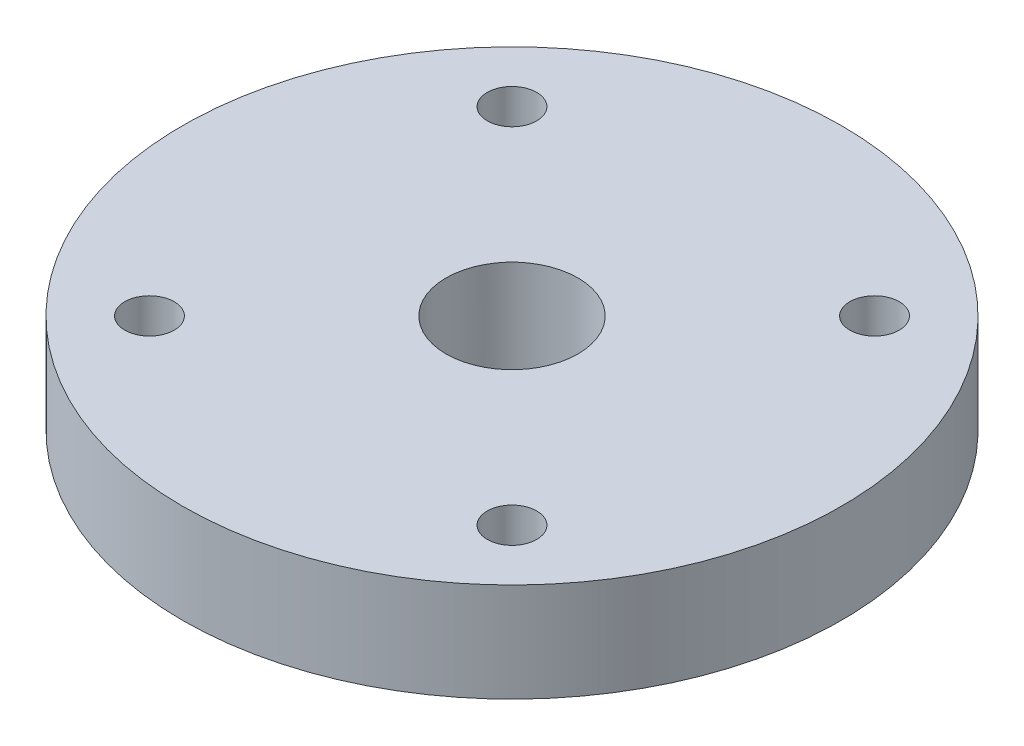
ISO-10303-21;
HEADER;
FILE_DESCRIPTION(('STEP AP214'),'2;1');
FILE_NAME('part.step','',(''),(''),'','','');
FILE_SCHEMA(('AUTOMOTIVE_DESIGN { 1 0 10303 214 1 1 1 1 }'));
ENDSEC;
DATA;
#1=APPLICATION_CONTEXT('core data for automotive mechanical design processes');
#2=APPLICATION_PROTOCOL_DEFINITION('international standard','automotive_design',2000,#1);
#3=PRODUCT_CONTEXT('',#1,'mechanical');
#4=PRODUCT('Part','Part','',(#3));
#5=PRODUCT_RELATED_PRODUCT_CATEGORY('part','',(#4));
#6=PRODUCT_DEFINITION_FORMATION('','',#4);
#7=PRODUCT_DEFINITION_CONTEXT('part definition',#1,'design');
#8=PRODUCT_DEFINITION('design','',#6,#7);
#9=PRODUCT_DEFINITION_SHAPE('','',#8);
#10=(LENGTH_UNIT() NAMED_UNIT(*) SI_UNIT(.MILLI.,.METRE.));
#11=(NAMED_UNIT(*) PLANE_ANGLE_UNIT() SI_UNIT($,.RADIAN.));
#12=(NAMED_UNIT(*) SI_UNIT($,.STERADIAN.) SOLID_ANGLE_UNIT());
#13=UNCERTAINTY_MEASURE_WITH_UNIT(LENGTH_MEASURE(1.E-05),#10,'distance_accuracy_value','');
#14=(GEOMETRIC_REPRESENTATION_CONTEXT(3) GLOBAL_UNCERTAINTY_ASSIGNED_CONTEXT((#13)) GLOBAL_UNIT_ASSIGNED_CONTEXT((#10,
#11,#12)) REPRESENTATION_CONTEXT('',''));
#15=CARTESIAN_POINT('',(0.,0.,0.));
#16=DIRECTION('',(0.,0.,1.));
#17=DIRECTION('',(1.,0.,0.));
#18=AXIS2_PLACEMENT_3D('',#15,#16,#17);
#19=CARTESIAN_POINT('',(0.,6.,0.));
#20=DIRECTION('',(0.,-1.,0.));
#21=DIRECTION('',(0.,0.,-1.));
#22=AXIS2_PLACEMENT_3D('',#19,#20,#21);
#23=CYLINDRICAL_SURFACE('',#22,20.);
#24=CARTESIAN_POINT('',(0.,6.,0.));
#25=DIRECTION('',(0.,1.,0.));
#26=DIRECTION('',(0.,0.,1.));
#27=AXIS2_PLACEMENT_3D('',#24,#25,#26);
#28=CIRCLE('',#27,20.);
#29=CARTESIAN_POINT('',(0.,6.,20.));
#30=VERTEX_POINT('',#29);
#31=EDGE_CURVE('E10',#30,#30,#28,.T.);
#32=ORIENTED_EDGE('',*,*,#31,.F.);
#33=EDGE_LOOP('',(#32));
#34=FACE_BOUND('',#33,.T.);
#35=CARTESIAN_POINT('',(0.,0.,0.));
#36=DIRECTION('',(0.,1.,0.));
#37=DIRECTION('',(0.,0.,1.));
#38=AXIS2_PLACEMENT_3D('',#35,#36,#37);
#39=CIRCLE('',#38,20.);
#40=CARTESIAN_POINT('',(0.,0.,20.));
#41=VERTEX_POINT('',#40);
#42=EDGE_CURVE('E36',#41,#41,#39,.T.);
#43=ORIENTED_EDGE('',*,*,#42,.T.);
#44=EDGE_LOOP('',(#43));
#45=FACE_BOUND('',#44,.T.);
#46=ADVANCED_FACE('F33',(#34,#45),#23,.T.);
#47=CARTESIAN_POINT('',(0.,6.,0.));
#48=DIRECTION('',(0.,1.,0.));
#49=DIRECTION('',(0.,0.,1.));
#50=AXIS2_PLACEMENT_3D('',#47,#48,#49);
#51=PLANE('',#50);
#52=CARTESIAN_POINT('',(0.,6.,0.));
#53=DIRECTION('',(0.,1.,0.));
#54=DIRECTION('',(0.,0.,1.));
#55=AXIS2_PLACEMENT_3D('',#52,#53,#54);
#56=CIRCLE('',#55,4.);
#57=CARTESIAN_POINT('',(0.,6.,4.));
#58=VERTEX_POINT('',#57);
#59=EDGE_CURVE('E68',#58,#58,#56,.F.);
#60=ORIENTED_EDGE('',*,*,#59,.T.);
#61=EDGE_LOOP('',(#60));
#62=FACE_BOUND('',#61,.T.);
#63=CARTESIAN_POINT('',(11.,6.,11.));
#64=DIRECTION('',(0.,1.,0.));
#65=DIRECTION('',(0.,0.,1.));
#66=AXIS2_PLACEMENT_3D('',#63,#64,#65);
#67=CIRCLE('',#66,1.5);
#68=CARTESIAN_POINT('',(11.,6.,12.5));
#69=VERTEX_POINT('',#68);
#70=EDGE_CURVE('E65',#69,#69,#67,.T.);
#71=ORIENTED_EDGE('',*,*,#70,.F.);
#72=EDGE_LOOP('',(#71));
#73=FACE_BOUND('',#72,.T.);
#74=CARTESIAN_POINT('',(-11.,6.,11.));
#75=DIRECTION('',(0.,1.,0.));
#76=DIRECTION('',(0.,0.,1.));
#77=AXIS2_PLACEMENT_3D('',#74,#75,#76);
#78=CIRCLE('',#77,1.5);
#79=CARTESIAN_POINT('',(-11.,6.,12.5));
#80=VERTEX_POINT('',#79);
#81=EDGE_CURVE('E59',#80,#80,#78,.T.);
#82=ORIENTED_EDGE('',*,*,#81,.F.);
#83=EDGE_LOOP('',(#82));
#84=FACE_BOUND('',#83,.T.);
#85=CARTESIAN_POINT('',(-11.,6.,-11.));
#86=DIRECTION('',(0.,1.,0.));
#87=DIRECTION('',(0.,0.,1.));
#88=AXIS2_PLACEMENT_3D('',#85,#86,#87);
#89=CIRCLE('',#88,1.5);
#90=CARTESIAN_POINT('',(-11.,6.,-9.5));
#91=VERTEX_POINT('',#90);
#92=EDGE_CURVE('E53',#91,#91,#89,.T.);
#93=ORIENTED_EDGE('',*,*,#92,.F.);
#94=EDGE_LOOP('',(#93));
#95=FACE_BOUND('',#94,.T.);
#96=CARTESIAN_POINT('',(11.,6.,-11.));
#97=DIRECTION('',(0.,1.,0.));
#98=DIRECTION('',(0.,0.,1.));
#99=AXIS2_PLACEMENT_3D('',#96,#97,#98);
#100=CIRCLE('',#99,1.5);
#101=CARTESIAN_POINT('',(11.,6.,-9.5));
#102=VERTEX_POINT('',#101);
#103=EDGE_CURVE('E47',#102,#102,#100,.T.);
#104=ORIENTED_EDGE('',*,*,#103,.F.);
#105=EDGE_LOOP('',(#104));
#106=FACE_BOUND('',#105,.T.);
#107=ORIENTED_EDGE('',*,*,#31,.T.);
#108=EDGE_LOOP('',(#107));
#109=FACE_BOUND('',#108,.T.);
#110=ADVANCED_FACE('F82',(#62,#73,#84,#95,#106,#109),#51,.T.);
#111=CARTESIAN_POINT('',(0.,0.,0.));
#112=DIRECTION('',(0.,1.,0.));
#113=DIRECTION('',(0.,0.,1.));
#114=AXIS2_PLACEMENT_3D('',#111,#112,#113);
#115=PLANE('',#114);
#116=CARTESIAN_POINT('',(0.,0.,0.));
#117=DIRECTION('',(0.,-1.,0.));
#118=DIRECTION('',(0.,0.,-1.));
#119=AXIS2_PLACEMENT_3D('',#116,#117,#118);
#120=CIRCLE('',#119,4.);
#121=CARTESIAN_POINT('',(0.,0.,-4.));
#122=VERTEX_POINT('',#121);
#123=EDGE_CURVE('E71',#122,#122,#120,.T.);
#124=ORIENTED_EDGE('',*,*,#123,.F.);
#125=EDGE_LOOP('',(#124));
#126=FACE_BOUND('',#125,.T.);
#127=CARTESIAN_POINT('',(11.,0.,11.));
#128=DIRECTION('',(0.,1.,0.));
#129=DIRECTION('',(0.,0.,1.));
#130=AXIS2_PLACEMENT_3D('',#127,#128,#129);
#131=CIRCLE('',#130,1.5);
#132=CARTESIAN_POINT('',(11.,0.,12.5));
#133=VERTEX_POINT('',#132);
#134=EDGE_CURVE('E62',#133,#133,#131,.F.);
#135=ORIENTED_EDGE('',*,*,#134,.F.);
#136=EDGE_LOOP('',(#135));
#137=FACE_BOUND('',#136,.T.);
#138=CARTESIAN_POINT('',(-11.,0.,11.));
#139=DIRECTION('',(0.,1.,0.));
#140=DIRECTION('',(0.,0.,1.));
#141=AXIS2_PLACEMENT_3D('',#138,#139,#140);
#142=CIRCLE('',#141,1.5);
#143=CARTESIAN_POINT('',(-11.,0.,12.5));
#144=VERTEX_POINT('',#143);
#145=EDGE_CURVE('E56',#144,#144,#142,.F.);
#146=ORIENTED_EDGE('',*,*,#145,.F.);
#147=EDGE_LOOP('',(#146));
#148=FACE_BOUND('',#147,.T.);
#149=CARTESIAN_POINT('',(-11.,0.,-11.));
#150=DIRECTION('',(0.,1.,0.));
#151=DIRECTION('',(0.,0.,1.));
#152=AXIS2_PLACEMENT_3D('',#149,#150,#151);
#153=CIRCLE('',#152,1.5);
#154=CARTESIAN_POINT('',(-11.,0.,-9.5));
#155=VERTEX_POINT('',#154);
#156=EDGE_CURVE('E50',#155,#155,#153,.F.);
#157=ORIENTED_EDGE('',*,*,#156,.F.);
#158=EDGE_LOOP('',(#157));
#159=FACE_BOUND('',#158,.T.);
#160=CARTESIAN_POINT('',(11.,0.,-11.));
#161=DIRECTION('',(0.,1.,0.));
#162=DIRECTION('',(0.,0.,1.));
#163=AXIS2_PLACEMENT_3D('',#160,#161,#162);
#164=CIRCLE('',#163,1.5);
#165=CARTESIAN_POINT('',(11.,0.,-9.5));
#166=VERTEX_POINT('',#165);
#167=EDGE_CURVE('E43',#166,#166,#164,.F.);
#168=ORIENTED_EDGE('',*,*,#167,.F.);
#169=EDGE_LOOP('',(#168));
#170=FACE_BOUND('',#169,.T.);
#171=ORIENTED_EDGE('',*,*,#42,.F.);
#172=EDGE_LOOP('',(#171));
#173=FACE_BOUND('',#172,.T.);
#174=ADVANCED_FACE('F78',(#126,#137,#148,#159,#170,#173),#115,.F.);
#175=CARTESIAN_POINT('',(11.,-4.24264068711929,-11.));
#176=DIRECTION('',(0.,1.,0.));
#177=DIRECTION('',(0.,0.,1.));
#178=AXIS2_PLACEMENT_3D('',#175,#176,#177);
#179=CYLINDRICAL_SURFACE('',#178,1.5);
#180=ORIENTED_EDGE('',*,*,#167,.T.);
#181=EDGE_LOOP('',(#180));
#182=FACE_BOUND('',#181,.T.);
#183=ORIENTED_EDGE('',*,*,#103,.T.);
#184=EDGE_LOOP('',(#183));
#185=FACE_BOUND('',#184,.T.);
#186=ADVANCED_FACE('F81',(#182,#185),#179,.F.);
#187=CARTESIAN_POINT('',(-11.,-4.24264068711929,-11.));
#188=DIRECTION('',(0.,1.,0.));
#189=DIRECTION('',(0.,0.,1.));
#190=AXIS2_PLACEMENT_3D('',#187,#188,#189);
#191=CYLINDRICAL_SURFACE('',#190,1.5);
#192=ORIENTED_EDGE('',*,*,#156,.T.);
#193=EDGE_LOOP('',(#192));
#194=FACE_BOUND('',#193,.T.);
#195=ORIENTED_EDGE('',*,*,#92,.T.);
#196=EDGE_LOOP('',(#195));
#197=FACE_BOUND('',#196,.T.);
#198=ADVANCED_FACE('F106',(#194,#197),#191,.F.);
#199=CARTESIAN_POINT('',(-11.,-4.24264068711929,11.));
#200=DIRECTION('',(0.,1.,0.));
#201=DIRECTION('',(0.,0.,1.));
#202=AXIS2_PLACEMENT_3D('',#199,#200,#201);
#203=CYLINDRICAL_SURFACE('',#202,1.5);
#204=ORIENTED_EDGE('',*,*,#145,.T.);
#205=EDGE_LOOP('',(#204));
#206=FACE_BOUND('',#205,.T.);
#207=ORIENTED_EDGE('',*,*,#81,.T.);
#208=EDGE_LOOP('',(#207));
#209=FACE_BOUND('',#208,.T.);
#210=ADVANCED_FACE('F110',(#206,#209),#203,.F.);
#211=CARTESIAN_POINT('',(11.,-4.24264068711929,11.));
#212=DIRECTION('',(0.,1.,0.));
#213=DIRECTION('',(0.,0.,1.));
#214=AXIS2_PLACEMENT_3D('',#211,#212,#213);
#215=CYLINDRICAL_SURFACE('',#214,1.5);
#216=ORIENTED_EDGE('',*,*,#134,.T.);
#217=EDGE_LOOP('',(#216));
#218=FACE_BOUND('',#217,.T.);
#219=ORIENTED_EDGE('',*,*,#70,.T.);
#220=EDGE_LOOP('',(#219));
#221=FACE_BOUND('',#220,.T.);
#222=ADVANCED_FACE('F114',(#218,#221),#215,.F.);
#223=CARTESIAN_POINT('',(0.,17.3137084989848,0.));
#224=DIRECTION('',(0.,-1.,0.));
#225=DIRECTION('',(0.,0.,-1.));
#226=AXIS2_PLACEMENT_3D('',#223,#224,#225);
#227=CYLINDRICAL_SURFACE('',#226,4.);
#228=ORIENTED_EDGE('',*,*,#123,.T.);
#229=EDGE_LOOP('',(#228));
#230=FACE_BOUND('',#229,.T.);
#231=ORIENTED_EDGE('',*,*,#59,.F.);
#232=EDGE_LOOP('',(#231));
#233=FACE_BOUND('',#232,.T.);
#234=ADVANCED_FACE('F75',(#230,#233),#227,.F.);
#235=CLOSED_SHELL('',(#46,#110,#174,#186,#198,#210,#222,#234));
#236=MANIFOLD_SOLID_BREP('B2',#235);
#237=ADVANCED_BREP_SHAPE_REPRESENTATION('',(#18,#236),#14);
#238=SHAPE_DEFINITION_REPRESENTATION(#9,#237);
ENDSEC;
END-ISO-10303-21;
